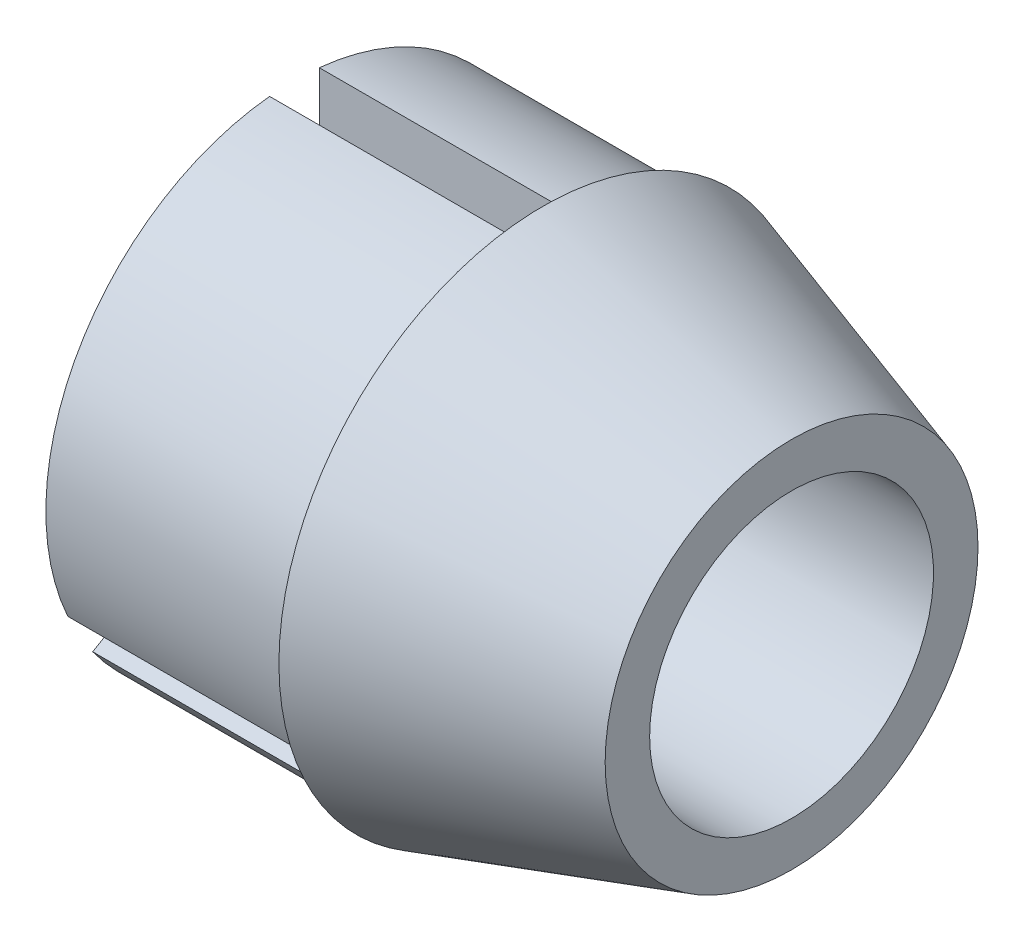
ISO-10303-21;
HEADER;
FILE_DESCRIPTION(('STEP AP214'),'2;1');
FILE_NAME('part.step','',(''),(''),'','','');
FILE_SCHEMA(('AUTOMOTIVE_DESIGN { 1 0 10303 214 1 1 1 1 }'));
ENDSEC;
DATA;
#1=APPLICATION_CONTEXT('core data for automotive mechanical design processes');
#2=APPLICATION_PROTOCOL_DEFINITION('international standard','automotive_design',2000,#1);
#3=PRODUCT_CONTEXT('',#1,'mechanical');
#4=PRODUCT('Part','Part','',(#3));
#5=PRODUCT_RELATED_PRODUCT_CATEGORY('part','',(#4));
#6=PRODUCT_DEFINITION_FORMATION('','',#4);
#7=PRODUCT_DEFINITION_CONTEXT('part definition',#1,'design');
#8=PRODUCT_DEFINITION('design','',#6,#7);
#9=PRODUCT_DEFINITION_SHAPE('','',#8);
#10=(LENGTH_UNIT() NAMED_UNIT(*) SI_UNIT(.MILLI.,.METRE.));
#11=(NAMED_UNIT(*) PLANE_ANGLE_UNIT() SI_UNIT($,.RADIAN.));
#12=(NAMED_UNIT(*) SI_UNIT($,.STERADIAN.) SOLID_ANGLE_UNIT());
#13=UNCERTAINTY_MEASURE_WITH_UNIT(LENGTH_MEASURE(1.E-05),#10,'distance_accuracy_value','');
#14=(GEOMETRIC_REPRESENTATION_CONTEXT(3) GLOBAL_UNCERTAINTY_ASSIGNED_CONTEXT((#13)) GLOBAL_UNIT_ASSIGNED_CONTEXT((#10,
#11,#12)) REPRESENTATION_CONTEXT('',''));
#15=CARTESIAN_POINT('',(0.,0.,0.));
#16=DIRECTION('',(0.,0.,1.));
#17=DIRECTION('',(1.,0.,0.));
#18=AXIS2_PLACEMENT_3D('',#15,#16,#17);
#19=CARTESIAN_POINT('',(-1.27,0.,0.));
#20=DIRECTION('',(-1.,0.,0.));
#21=DIRECTION('',(0.,0.,1.));
#22=AXIS2_PLACEMENT_3D('',#19,#20,#21);
#23=CYLINDRICAL_SURFACE('',#22,25.4);
#24=CARTESIAN_POINT('',(-25.4,0.,0.));
#25=DIRECTION('',(-1.,0.,0.));
#26=DIRECTION('',(0.,0.,1.));
#27=AXIS2_PLACEMENT_3D('',#24,#25,#26);
#28=CIRCLE('',#27,25.4);
#29=CARTESIAN_POINT('',(-25.4,25.2726809025081,-2.54));
#30=VERTEX_POINT('',#29);
#31=CARTESIAN_POINT('',(-25.4,-10.4366359256414,-23.15678368331));
#32=VERTEX_POINT('',#31);
#33=EDGE_CURVE('E11',#30,#32,#28,.T.);
#34=ORIENTED_EDGE('',*,*,#33,.F.);
#35=DIRECTION('',(-1.,0.,0.));
#36=VECTOR('',#35,1.);
#37=CARTESIAN_POINT('',(-1.27,25.2726809025081,-2.54));
#38=LINE('',#37,#36);
#39=CARTESIAN_POINT('',(0.,25.2726809025081,-2.54));
#40=VERTEX_POINT('',#39);
#41=EDGE_CURVE('E168',#30,#40,#38,.F.);
#42=ORIENTED_EDGE('',*,*,#41,.T.);
#43=CARTESIAN_POINT('',(0.,0.,0.));
#44=DIRECTION('',(-1.,0.,0.));
#45=DIRECTION('',(0.,0.,1.));
#46=AXIS2_PLACEMENT_3D('',#43,#44,#45);
#47=CIRCLE('',#46,25.4);
#48=CARTESIAN_POINT('',(0.,-10.4366359256414,-23.15678368331));
#49=VERTEX_POINT('',#48);
#50=EDGE_CURVE('E160',#40,#49,#47,.T.);
#51=ORIENTED_EDGE('',*,*,#50,.T.);
#52=DIRECTION('',(-1.,0.,0.));
#53=VECTOR('',#52,1.);
#54=CARTESIAN_POINT('',(-1.27,-10.4366359256414,-23.15678368331));
#55=LINE('',#54,#53);
#56=EDGE_CURVE('E236',#49,#32,#55,.T.);
#57=ORIENTED_EDGE('',*,*,#56,.T.);
#58=EDGE_LOOP('',(#34,#42,#51,#57));
#59=FACE_BOUND('',#58,.T.);
#60=ADVANCED_FACE('F44',(#59),#23,.T.);
#61=CARTESIAN_POINT('',(0.,-14.8360449768664,-20.61678368331));
#62=VERTEX_POINT('',#61);
#63=CARTESIAN_POINT('',(0.,-14.8360449768666,20.6167836833098));
#64=VERTEX_POINT('',#63);
#65=EDGE_CURVE('E150',#62,#64,#47,.T.);
#66=ORIENTED_EDGE('',*,*,#65,.T.);
#67=DIRECTION('',(-1.,0.,0.));
#68=VECTOR('',#67,1.);
#69=CARTESIAN_POINT('',(-1.27,-14.8360449768666,20.6167836833098));
#70=LINE('',#69,#68);
#71=CARTESIAN_POINT('',(-25.4,-14.8360449768666,20.6167836833098));
#72=VERTEX_POINT('',#71);
#73=EDGE_CURVE('E251',#64,#72,#70,.T.);
#74=ORIENTED_EDGE('',*,*,#73,.T.);
#75=CARTESIAN_POINT('',(-25.4,-14.8360449768664,-20.61678368331));
#76=VERTEX_POINT('',#75);
#77=EDGE_CURVE('E54',#76,#72,#28,.T.);
#78=ORIENTED_EDGE('',*,*,#77,.F.);
#79=DIRECTION('',(-1.,0.,0.));
#80=VECTOR('',#79,1.);
#81=CARTESIAN_POINT('',(-1.27,-14.8360449768664,-20.61678368331));
#82=LINE('',#81,#80);
#83=EDGE_CURVE('E136',#76,#62,#82,.F.);
#84=ORIENTED_EDGE('',*,*,#83,.T.);
#85=EDGE_LOOP('',(#66,#74,#78,#84));
#86=FACE_BOUND('',#85,.T.);
#87=ADVANCED_FACE('F148',(#86),#23,.T.);
#88=CARTESIAN_POINT('',(-25.4,25.4,0.));
#89=DIRECTION('',(1.,0.,0.));
#90=DIRECTION('',(0.,0.,-1.));
#91=AXIS2_PLACEMENT_3D('',#88,#89,#90);
#92=PLANE('',#91);
#93=CARTESIAN_POINT('',(-25.4,0.,0.));
#94=DIRECTION('',(-1.,0.,0.));
#95=DIRECTION('',(0.,0.,1.));
#96=AXIS2_PLACEMENT_3D('',#93,#94,#95);
#97=CIRCLE('',#96,16.0909);
#98=CARTESIAN_POINT('',(-25.4,15.8891618032544,-2.54));
#99=VERTEX_POINT('',#98);
#100=CARTESIAN_POINT('',(-25.4,-5.74487637601461,-15.0304177664598));
#101=VERTEX_POINT('',#100);
#102=EDGE_CURVE('E196',#99,#101,#97,.T.);
#103=ORIENTED_EDGE('',*,*,#102,.F.);
#104=DIRECTION('',(0.,-1.,0.));
#105=VECTOR('',#104,1.);
#106=CARTESIAN_POINT('',(-25.4,31.75,-2.54));
#107=LINE('',#106,#105);
#108=EDGE_CURVE('E311',#30,#99,#107,.T.);
#109=ORIENTED_EDGE('',*,*,#108,.F.);
#110=ORIENTED_EDGE('',*,*,#33,.T.);
#111=DIRECTION('',(0.,-0.499999999999992,-0.866025403784443));
#112=VECTOR('',#111,1.);
#113=CARTESIAN_POINT('',(-25.4,-13.6752954743873,-28.7663065701561));
#114=LINE('',#113,#112);
#115=EDGE_CURVE('E222',#101,#32,#114,.T.);
#116=ORIENTED_EDGE('',*,*,#115,.F.);
#117=EDGE_LOOP('',(#103,#109,#110,#116));
#118=FACE_BOUND('',#117,.T.);
#119=ADVANCED_FACE('F287',(#118),#92,.F.);
#120=ORIENTED_EDGE('',*,*,#77,.T.);
#121=DIRECTION('',(0.,-0.500000000000004,0.866025403784436));
#122=VECTOR('',#121,1.);
#123=CARTESIAN_POINT('',(-25.4,-18.0747045256126,26.2263065701558));
#124=LINE('',#123,#122);
#125=CARTESIAN_POINT('',(-25.4,-10.1442854272398,12.4904177664597));
#126=VERTEX_POINT('',#125);
#127=EDGE_CURVE('E220',#126,#72,#124,.T.);
#128=ORIENTED_EDGE('',*,*,#127,.F.);
#129=CARTESIAN_POINT('',(-25.4,-10.1442854272396,-12.4904177664598));
#130=VERTEX_POINT('',#129);
#131=EDGE_CURVE('E195',#130,#126,#97,.T.);
#132=ORIENTED_EDGE('',*,*,#131,.F.);
#133=DIRECTION('',(0.,0.499999999999992,0.866025403784443));
#134=VECTOR('',#133,1.);
#135=CARTESIAN_POINT('',(-25.4,-18.0747045256122,-26.2263065701561));
#136=LINE('',#135,#134);
#137=EDGE_CURVE('E69',#76,#130,#136,.T.);
#138=ORIENTED_EDGE('',*,*,#137,.F.);
#139=EDGE_LOOP('',(#120,#128,#132,#138));
#140=FACE_BOUND('',#139,.T.);
#141=ADVANCED_FACE('F218',(#140),#92,.F.);
#142=CARTESIAN_POINT('',(-1.27,0.,0.));
#143=DIRECTION('',(-1.,0.,0.));
#144=DIRECTION('',(0.,0.,1.));
#145=AXIS2_PLACEMENT_3D('',#142,#143,#144);
#146=CYLINDRICAL_SURFACE('',#145,16.0909);
#147=CARTESIAN_POINT('',(0.,0.,0.));
#148=DIRECTION('',(-1.,0.,0.));
#149=DIRECTION('',(0.,0.,1.));
#150=AXIS2_PLACEMENT_3D('',#147,#148,#149);
#151=CIRCLE('',#150,16.0909);
#152=CARTESIAN_POINT('',(0.,15.8891618032544,-2.54));
#153=VERTEX_POINT('',#152);
#154=CARTESIAN_POINT('',(0.,-5.74487637601461,-15.0304177664598));
#155=VERTEX_POINT('',#154);
#156=EDGE_CURVE('E191',#153,#155,#151,.T.);
#157=ORIENTED_EDGE('',*,*,#156,.F.);
#158=DIRECTION('',(-1.,0.,0.));
#159=VECTOR('',#158,1.);
#160=CARTESIAN_POINT('',(-1.27,15.8891618032544,-2.54));
#161=LINE('',#160,#159);
#162=EDGE_CURVE('E260',#153,#99,#161,.T.);
#163=ORIENTED_EDGE('',*,*,#162,.T.);
#164=ORIENTED_EDGE('',*,*,#102,.T.);
#165=DIRECTION('',(-1.,0.,0.));
#166=VECTOR('',#165,1.);
#167=CARTESIAN_POINT('',(-1.27,-5.74487637601461,-15.0304177664598));
#168=LINE('',#167,#166);
#169=EDGE_CURVE('E153',#101,#155,#168,.F.);
#170=ORIENTED_EDGE('',*,*,#169,.T.);
#171=EDGE_LOOP('',(#157,#163,#164,#170));
#172=FACE_BOUND('',#171,.T.);
#173=ADVANCED_FACE('F277',(#172),#146,.F.);
#174=ORIENTED_EDGE('',*,*,#131,.T.);
#175=DIRECTION('',(-1.,0.,0.));
#176=VECTOR('',#175,1.);
#177=CARTESIAN_POINT('',(-1.27,-10.1442854272398,12.4904177664597));
#178=LINE('',#177,#176);
#179=CARTESIAN_POINT('',(0.,-10.1442854272398,12.4904177664597));
#180=VERTEX_POINT('',#179);
#181=EDGE_CURVE('E247',#126,#180,#178,.F.);
#182=ORIENTED_EDGE('',*,*,#181,.T.);
#183=CARTESIAN_POINT('',(0.,-10.1442854272396,-12.4904177664598));
#184=VERTEX_POINT('',#183);
#185=EDGE_CURVE('E190',#184,#180,#151,.T.);
#186=ORIENTED_EDGE('',*,*,#185,.F.);
#187=DIRECTION('',(-1.,0.,0.));
#188=VECTOR('',#187,1.);
#189=CARTESIAN_POINT('',(-1.27,-10.1442854272396,-12.4904177664598));
#190=LINE('',#189,#188);
#191=EDGE_CURVE('E137',#184,#130,#190,.T.);
#192=ORIENTED_EDGE('',*,*,#191,.T.);
#193=EDGE_LOOP('',(#174,#182,#186,#192));
#194=FACE_BOUND('',#193,.T.);
#195=ADVANCED_FACE('F279',(#194),#146,.F.);
#196=CARTESIAN_POINT('',(0.,-10.4366359256417,23.1567836833098));
#197=VERTEX_POINT('',#196);
#198=CARTESIAN_POINT('',(0.,25.2726809025081,2.54));
#199=VERTEX_POINT('',#198);
#200=EDGE_CURVE('E161',#197,#199,#47,.T.);
#201=ORIENTED_EDGE('',*,*,#200,.T.);
#202=DIRECTION('',(-1.,0.,0.));
#203=VECTOR('',#202,1.);
#204=CARTESIAN_POINT('',(-1.27,25.2726809025081,2.54));
#205=LINE('',#204,#203);
#206=CARTESIAN_POINT('',(-25.4,25.2726809025081,2.54));
#207=VERTEX_POINT('',#206);
#208=EDGE_CURVE('E257',#199,#207,#205,.T.);
#209=ORIENTED_EDGE('',*,*,#208,.T.);
#210=CARTESIAN_POINT('',(-25.4,-10.4366359256417,23.1567836833098));
#211=VERTEX_POINT('',#210);
#212=EDGE_CURVE('E48',#211,#207,#28,.T.);
#213=ORIENTED_EDGE('',*,*,#212,.F.);
#214=DIRECTION('',(-1.,0.,0.));
#215=VECTOR('',#214,1.);
#216=CARTESIAN_POINT('',(-1.27,-10.4366359256417,23.1567836833098));
#217=LINE('',#216,#215);
#218=EDGE_CURVE('E243',#211,#197,#217,.F.);
#219=ORIENTED_EDGE('',*,*,#218,.T.);
#220=EDGE_LOOP('',(#201,#209,#213,#219));
#221=FACE_BOUND('',#220,.T.);
#222=ADVANCED_FACE('F46',(#221),#23,.T.);
#223=ORIENTED_EDGE('',*,*,#212,.T.);
#224=DIRECTION('',(0.,1.,0.));
#225=VECTOR('',#224,1.);
#226=CARTESIAN_POINT('',(-25.4,31.75,2.54));
#227=LINE('',#226,#225);
#228=CARTESIAN_POINT('',(-25.4,15.8891618032544,2.54));
#229=VERTEX_POINT('',#228);
#230=EDGE_CURVE('E314',#229,#207,#227,.T.);
#231=ORIENTED_EDGE('',*,*,#230,.F.);
#232=CARTESIAN_POINT('',(-25.4,-5.74487637601482,15.0304177664597));
#233=VERTEX_POINT('',#232);
#234=EDGE_CURVE('E192',#233,#229,#97,.T.);
#235=ORIENTED_EDGE('',*,*,#234,.F.);
#236=DIRECTION('',(0.,0.500000000000004,-0.866025403784436));
#237=VECTOR('',#236,1.);
#238=CARTESIAN_POINT('',(-25.4,-13.6752954743877,28.7663065701559));
#239=LINE('',#238,#237);
#240=EDGE_CURVE('E61',#211,#233,#239,.T.);
#241=ORIENTED_EDGE('',*,*,#240,.F.);
#242=EDGE_LOOP('',(#223,#231,#235,#241));
#243=FACE_BOUND('',#242,.T.);
#244=ADVANCED_FACE('F288',(#243),#92,.F.);
#245=ORIENTED_EDGE('',*,*,#234,.T.);
#246=DIRECTION('',(-1.,0.,0.));
#247=VECTOR('',#246,1.);
#248=CARTESIAN_POINT('',(-1.27,15.8891618032544,2.54));
#249=LINE('',#248,#247);
#250=CARTESIAN_POINT('',(0.,15.8891618032544,2.54));
#251=VERTEX_POINT('',#250);
#252=EDGE_CURVE('E254',#229,#251,#249,.F.);
#253=ORIENTED_EDGE('',*,*,#252,.T.);
#254=CARTESIAN_POINT('',(0.,-5.74487637601481,15.0304177664597));
#255=VERTEX_POINT('',#254);
#256=EDGE_CURVE('E187',#255,#251,#151,.T.);
#257=ORIENTED_EDGE('',*,*,#256,.F.);
#258=DIRECTION('',(-1.,0.,0.));
#259=VECTOR('',#258,1.);
#260=CARTESIAN_POINT('',(-1.27,-5.74487637601482,15.0304177664597));
#261=LINE('',#260,#259);
#262=EDGE_CURVE('E240',#255,#233,#261,.T.);
#263=ORIENTED_EDGE('',*,*,#262,.T.);
#264=EDGE_LOOP('',(#245,#253,#257,#263));
#265=FACE_BOUND('',#264,.T.);
#266=ADVANCED_FACE('F281',(#265),#146,.F.);
#267=CARTESIAN_POINT('',(-1.27,0.,0.));
#268=DIRECTION('',(-1.,0.,0.));
#269=DIRECTION('',(0.,0.,1.));
#270=AXIS2_PLACEMENT_3D('',#267,#268,#269);
#271=CYLINDRICAL_SURFACE('',#270,14.5034);
#272=CARTESIAN_POINT('',(25.4,0.,0.));
#273=DIRECTION('',(-1.,0.,0.));
#274=DIRECTION('',(0.,0.,1.));
#275=AXIS2_PLACEMENT_3D('',#272,#273,#274);
#276=CIRCLE('',#275,14.5034);
#277=CARTESIAN_POINT('',(25.4,0.,14.5034));
#278=VERTEX_POINT('',#277);
#279=EDGE_CURVE('E179',#278,#278,#276,.T.);
#280=ORIENTED_EDGE('',*,*,#279,.F.);
#281=EDGE_LOOP('',(#280));
#282=FACE_BOUND('',#281,.T.);
#283=CARTESIAN_POINT('',(0.,0.,0.));
#284=DIRECTION('',(-1.,0.,0.));
#285=DIRECTION('',(0.,0.,1.));
#286=AXIS2_PLACEMENT_3D('',#283,#284,#285);
#287=CIRCLE('',#286,14.5034);
#288=CARTESIAN_POINT('',(0.,0.,14.5034));
#289=VERTEX_POINT('',#288);
#290=EDGE_CURVE('E183',#289,#289,#287,.T.);
#291=ORIENTED_EDGE('',*,*,#290,.T.);
#292=EDGE_LOOP('',(#291));
#293=FACE_BOUND('',#292,.T.);
#294=ADVANCED_FACE('F291',(#282,#293),#271,.F.);
#295=CARTESIAN_POINT('',(25.4,19.05,0.));
#296=DIRECTION('',(-1.,0.,0.));
#297=DIRECTION('',(0.,0.,1.));
#298=AXIS2_PLACEMENT_3D('',#295,#296,#297);
#299=PLANE('',#298);
#300=CARTESIAN_POINT('',(25.4,0.,0.));
#301=DIRECTION('',(-1.,0.,0.));
#302=DIRECTION('',(0.,0.,1.));
#303=AXIS2_PLACEMENT_3D('',#300,#301,#302);
#304=CIRCLE('',#303,19.05);
#305=CARTESIAN_POINT('',(25.4,0.,19.05));
#306=VERTEX_POINT('',#305);
#307=EDGE_CURVE('E175',#306,#306,#304,.T.);
#308=ORIENTED_EDGE('',*,*,#307,.F.);
#309=EDGE_LOOP('',(#308));
#310=FACE_BOUND('',#309,.T.);
#311=ORIENTED_EDGE('',*,*,#279,.T.);
#312=EDGE_LOOP('',(#311));
#313=FACE_BOUND('',#312,.T.);
#314=ADVANCED_FACE('F365',(#310,#313),#299,.F.);
#315=CARTESIAN_POINT('',(25.4,0.,0.));
#316=DIRECTION('',(-1.,0.,0.));
#317=DIRECTION('',(0.,0.,1.));
#318=AXIS2_PLACEMENT_3D('',#315,#316,#317);
#319=CONICAL_SURFACE('',#318,19.05,0.302884868374971);
#320=CARTESIAN_POINT('',(0.,0.,0.));
#321=DIRECTION('',(-1.,0.,0.));
#322=DIRECTION('',(0.,0.,1.));
#323=AXIS2_PLACEMENT_3D('',#320,#321,#322);
#324=CIRCLE('',#323,26.9875);
#325=CARTESIAN_POINT('',(0.,0.,26.9875));
#326=VERTEX_POINT('',#325);
#327=EDGE_CURVE('E166',#326,#326,#324,.T.);
#328=ORIENTED_EDGE('',*,*,#327,.F.);
#329=EDGE_LOOP('',(#328));
#330=FACE_BOUND('',#329,.T.);
#331=ORIENTED_EDGE('',*,*,#307,.T.);
#332=EDGE_LOOP('',(#331));
#333=FACE_BOUND('',#332,.T.);
#334=ADVANCED_FACE('F356',(#330,#333),#319,.T.);
#335=CARTESIAN_POINT('',(0.,26.9875,0.));
#336=DIRECTION('',(1.,0.,0.));
#337=DIRECTION('',(0.,0.,-1.));
#338=AXIS2_PLACEMENT_3D('',#335,#336,#337);
#339=PLANE('',#338);
#340=ORIENTED_EDGE('',*,*,#50,.F.);
#341=DIRECTION('',(0.,-1.,0.));
#342=VECTOR('',#341,1.);
#343=CARTESIAN_POINT('',(0.,31.75,-2.54));
#344=LINE('',#343,#342);
#345=EDGE_CURVE('E273',#40,#153,#344,.T.);
#346=ORIENTED_EDGE('',*,*,#345,.T.);
#347=ORIENTED_EDGE('',*,*,#156,.T.);
#348=DIRECTION('',(0.,-0.499999999999992,-0.866025403784443));
#349=VECTOR('',#348,1.);
#350=CARTESIAN_POINT('',(0.,-13.6752954743873,-28.7663065701561));
#351=LINE('',#350,#349);
#352=EDGE_CURVE('E143',#155,#49,#351,.T.);
#353=ORIENTED_EDGE('',*,*,#352,.T.);
#354=EDGE_LOOP('',(#340,#346,#347,#353));
#355=FACE_BOUND('',#354,.T.);
#356=ORIENTED_EDGE('',*,*,#200,.F.);
#357=DIRECTION('',(0.,0.500000000000004,-0.866025403784436));
#358=VECTOR('',#357,1.);
#359=CARTESIAN_POINT('',(0.,-13.6752954743877,28.7663065701559));
#360=LINE('',#359,#358);
#361=EDGE_CURVE('E226',#197,#255,#360,.T.);
#362=ORIENTED_EDGE('',*,*,#361,.T.);
#363=ORIENTED_EDGE('',*,*,#256,.T.);
#364=DIRECTION('',(0.,1.,0.));
#365=VECTOR('',#364,1.);
#366=CARTESIAN_POINT('',(0.,31.75,2.54));
#367=LINE('',#366,#365);
#368=EDGE_CURVE('E232',#251,#199,#367,.T.);
#369=ORIENTED_EDGE('',*,*,#368,.T.);
#370=EDGE_LOOP('',(#356,#362,#363,#369));
#371=FACE_BOUND('',#370,.T.);
#372=ORIENTED_EDGE('',*,*,#327,.T.);
#373=EDGE_LOOP('',(#372));
#374=FACE_BOUND('',#373,.T.);
#375=DIRECTION('',(0.,-0.500000000000004,0.866025403784436));
#376=VECTOR('',#375,1.);
#377=CARTESIAN_POINT('',(0.,-18.0747045256126,26.2263065701558));
#378=LINE('',#377,#376);
#379=EDGE_CURVE('E158',#180,#64,#378,.T.);
#380=ORIENTED_EDGE('',*,*,#379,.T.);
#381=ORIENTED_EDGE('',*,*,#65,.F.);
#382=DIRECTION('',(0.,0.499999999999992,0.866025403784443));
#383=VECTOR('',#382,1.);
#384=CARTESIAN_POINT('',(0.,-18.0747045256122,-26.2263065701561));
#385=LINE('',#384,#383);
#386=EDGE_CURVE('E133',#62,#184,#385,.T.);
#387=ORIENTED_EDGE('',*,*,#386,.T.);
#388=ORIENTED_EDGE('',*,*,#185,.T.);
#389=EDGE_LOOP('',(#380,#381,#387,#388));
#390=FACE_BOUND('',#389,.T.);
#391=ORIENTED_EDGE('',*,*,#290,.F.);
#392=EDGE_LOOP('',(#391));
#393=FACE_BOUND('',#392,.T.);
#394=ADVANCED_FACE('F156',(#355,#371,#374,#390,#393),#339,.F.);
#395=CARTESIAN_POINT('',(29.9074636136572,-13.6752954743873,-28.7663065701561));
#396=DIRECTION('',(0.,0.866025403784443,-0.499999999999992));
#397=DIRECTION('',(0.,0.499999999999992,0.866025403784443));
#398=AXIS2_PLACEMENT_3D('',#395,#396,#397);
#399=PLANE('',#398);
#400=ORIENTED_EDGE('',*,*,#352,.F.);
#401=ORIENTED_EDGE('',*,*,#169,.F.);
#402=ORIENTED_EDGE('',*,*,#115,.T.);
#403=ORIENTED_EDGE('',*,*,#56,.F.);
#404=EDGE_LOOP('',(#400,#401,#402,#403));
#405=FACE_BOUND('',#404,.T.);
#406=ADVANCED_FACE('F275',(#405),#399,.F.);
#407=CARTESIAN_POINT('',(29.9074636136572,-18.0747045256122,-26.2263065701561));
#408=DIRECTION('',(0.,-0.866025403784443,0.499999999999992));
#409=DIRECTION('',(0.,-0.499999999999992,-0.866025403784443));
#410=AXIS2_PLACEMENT_3D('',#407,#408,#409);
#411=PLANE('',#410);
#412=ORIENTED_EDGE('',*,*,#137,.T.);
#413=ORIENTED_EDGE('',*,*,#191,.F.);
#414=ORIENTED_EDGE('',*,*,#386,.F.);
#415=ORIENTED_EDGE('',*,*,#83,.F.);
#416=EDGE_LOOP('',(#412,#413,#414,#415));
#417=FACE_BOUND('',#416,.T.);
#418=ADVANCED_FACE('F135',(#417),#411,.F.);
#419=CARTESIAN_POINT('',(29.9074636136572,-18.0747045256126,26.2263065701558));
#420=DIRECTION('',(0.,-0.866025403784436,-0.500000000000004));
#421=DIRECTION('',(0.,0.500000000000004,-0.866025403784436));
#422=AXIS2_PLACEMENT_3D('',#419,#420,#421);
#423=PLANE('',#422);
#424=ORIENTED_EDGE('',*,*,#379,.F.);
#425=ORIENTED_EDGE('',*,*,#181,.F.);
#426=ORIENTED_EDGE('',*,*,#127,.T.);
#427=ORIENTED_EDGE('',*,*,#73,.F.);
#428=EDGE_LOOP('',(#424,#425,#426,#427));
#429=FACE_BOUND('',#428,.T.);
#430=ADVANCED_FACE('F416',(#429),#423,.F.);
#431=CARTESIAN_POINT('',(29.9074636136572,-13.6752954743877,28.7663065701559));
#432=DIRECTION('',(0.,0.866025403784436,0.500000000000004));
#433=DIRECTION('',(0.,-0.500000000000004,0.866025403784436));
#434=AXIS2_PLACEMENT_3D('',#431,#432,#433);
#435=PLANE('',#434);
#436=ORIENTED_EDGE('',*,*,#240,.T.);
#437=ORIENTED_EDGE('',*,*,#262,.F.);
#438=ORIENTED_EDGE('',*,*,#361,.F.);
#439=ORIENTED_EDGE('',*,*,#218,.F.);
#440=EDGE_LOOP('',(#436,#437,#438,#439));
#441=FACE_BOUND('',#440,.T.);
#442=ADVANCED_FACE('F424',(#441),#435,.F.);
#443=CARTESIAN_POINT('',(29.9074636136572,31.75,-2.54));
#444=DIRECTION('',(0.,0.,-1.));
#445=DIRECTION('',(0.,1.,0.));
#446=AXIS2_PLACEMENT_3D('',#443,#444,#445);
#447=PLANE('',#446);
#448=ORIENTED_EDGE('',*,*,#108,.T.);
#449=ORIENTED_EDGE('',*,*,#162,.F.);
#450=ORIENTED_EDGE('',*,*,#345,.F.);
#451=ORIENTED_EDGE('',*,*,#41,.F.);
#452=EDGE_LOOP('',(#448,#449,#450,#451));
#453=FACE_BOUND('',#452,.T.);
#454=ADVANCED_FACE('F326',(#453),#447,.F.);
#455=CARTESIAN_POINT('',(29.9074636136572,31.75,2.54));
#456=DIRECTION('',(0.,0.,1.));
#457=DIRECTION('',(0.,-1.,0.));
#458=AXIS2_PLACEMENT_3D('',#455,#456,#457);
#459=PLANE('',#458);
#460=ORIENTED_EDGE('',*,*,#368,.F.);
#461=ORIENTED_EDGE('',*,*,#252,.F.);
#462=ORIENTED_EDGE('',*,*,#230,.T.);
#463=ORIENTED_EDGE('',*,*,#208,.F.);
#464=EDGE_LOOP('',(#460,#461,#462,#463));
#465=FACE_BOUND('',#464,.T.);
#466=ADVANCED_FACE('F440',(#465),#459,.F.);
#467=CLOSED_SHELL('',(#60,#87,#119,#141,#173,#195,#222,#244,#266,#294,#314,#334,#394,#406,#418,
#430,#442,#454,#466));
#468=MANIFOLD_SOLID_BREP('B2',#467);
#469=ADVANCED_BREP_SHAPE_REPRESENTATION('',(#18,#468),#14);
#470=SHAPE_DEFINITION_REPRESENTATION(#9,#469);
ENDSEC;
END-ISO-10303-21;
